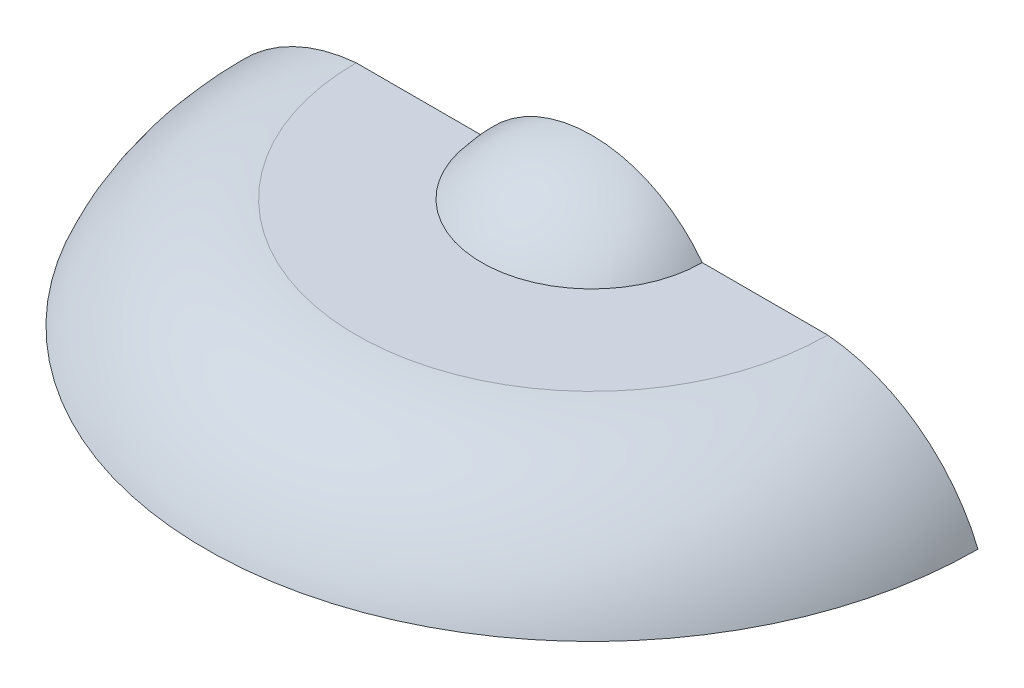
ISO-10303-21;
HEADER;
FILE_DESCRIPTION(('STEP AP214'),'2;1');
FILE_NAME('part.step','',(''),(''),'','','');
FILE_SCHEMA(('AUTOMOTIVE_DESIGN { 1 0 10303 214 1 1 1 1 }'));
ENDSEC;
DATA;
#1=APPLICATION_CONTEXT('core data for automotive mechanical design processes');
#2=APPLICATION_PROTOCOL_DEFINITION('international standard','automotive_design',2000,#1);
#3=PRODUCT_CONTEXT('',#1,'mechanical');
#4=PRODUCT('Part','Part','',(#3));
#5=PRODUCT_RELATED_PRODUCT_CATEGORY('part','',(#4));
#6=PRODUCT_DEFINITION_FORMATION('','',#4);
#7=PRODUCT_DEFINITION_CONTEXT('part definition',#1,'design');
#8=PRODUCT_DEFINITION('design','',#6,#7);
#9=PRODUCT_DEFINITION_SHAPE('','',#8);
#10=(LENGTH_UNIT() NAMED_UNIT(*) SI_UNIT(.MILLI.,.METRE.));
#11=(NAMED_UNIT(*) PLANE_ANGLE_UNIT() SI_UNIT($,.RADIAN.));
#12=(NAMED_UNIT(*) SI_UNIT($,.STERADIAN.) SOLID_ANGLE_UNIT());
#13=UNCERTAINTY_MEASURE_WITH_UNIT(LENGTH_MEASURE(1.E-05),#10,'distance_accuracy_value','');
#14=(GEOMETRIC_REPRESENTATION_CONTEXT(3) GLOBAL_UNCERTAINTY_ASSIGNED_CONTEXT((#13)) GLOBAL_UNIT_ASSIGNED_CONTEXT((#10,
#11,#12)) REPRESENTATION_CONTEXT('',''));
#15=CARTESIAN_POINT('',(0.,0.,0.));
#16=DIRECTION('',(0.,0.,1.));
#17=DIRECTION('',(1.,0.,0.));
#18=AXIS2_PLACEMENT_3D('',#15,#16,#17);
#19=CARTESIAN_POINT('',(0.,6.35,0.));
#20=DIRECTION('',(0.,1.,0.));
#21=DIRECTION('',(-1.,0.,0.));
#22=AXIS2_PLACEMENT_3D('',#19,#20,#21);
#23=SPHERICAL_SURFACE('',#22,31.75);
#24=CARTESIAN_POINT('',(0.,25.4,0.));
#25=DIRECTION('',(0.,1.,0.));
#26=DIRECTION('',(-1.,0.,0.));
#27=AXIS2_PLACEMENT_3D('',#24,#25,#26);
#28=CIRCLE('',#27,25.4);
#29=CARTESIAN_POINT('',(-25.4,25.4,-1.77367252013231E-13));
#30=VERTEX_POINT('',#29);
#31=CARTESIAN_POINT('',(25.4,25.4,0.));
#32=VERTEX_POINT('',#31);
#33=EDGE_CURVE('E11',#30,#32,#28,.T.);
#34=ORIENTED_EDGE('',*,*,#33,.T.);
#35=CARTESIAN_POINT('',(0.,6.35,0.));
#36=DIRECTION('',(0.,0.,-1.));
#37=DIRECTION('',(1.,0.,0.));
#38=AXIS2_PLACEMENT_3D('',#35,#36,#37);
#39=CIRCLE('',#38,31.75);
#40=EDGE_CURVE('E79',#30,#32,#39,.T.);
#41=ORIENTED_EDGE('',*,*,#40,.F.);
#42=EDGE_LOOP('',(#34,#41));
#43=FACE_BOUND('',#42,.T.);
#44=ADVANCED_FACE('F34',(#43),#23,.T.);
#45=CARTESIAN_POINT('',(-54.2790064812948,25.4,-3.79028276440773E-13));
#46=DIRECTION('',(0.,-1.,0.));
#47=DIRECTION('',(1.,0.,0.));
#48=AXIS2_PLACEMENT_3D('',#45,#46,#47);
#49=PLANE('',#48);
#50=CARTESIAN_POINT('',(0.,25.4,0.));
#51=DIRECTION('',(0.,1.,0.));
#52=DIRECTION('',(-1.,0.,0.));
#53=AXIS2_PLACEMENT_3D('',#50,#51,#52);
#54=CIRCLE('',#53,54.2790064812948);
#55=CARTESIAN_POINT('',(-54.2790064812948,25.4,-3.79028276440773E-13));
#56=VERTEX_POINT('',#55);
#57=CARTESIAN_POINT('',(54.2790064812948,25.4,0.));
#58=VERTEX_POINT('',#57);
#59=EDGE_CURVE('E41',#56,#58,#54,.T.);
#60=ORIENTED_EDGE('',*,*,#59,.T.);
#61=DIRECTION('',(-1.,0.,0.));
#62=VECTOR('',#61,1.);
#63=CARTESIAN_POINT('',(54.2790064812948,25.4,0.));
#64=LINE('',#63,#62);
#65=EDGE_CURVE('E74',#58,#32,#64,.T.);
#66=ORIENTED_EDGE('',*,*,#65,.T.);
#67=ORIENTED_EDGE('',*,*,#33,.F.);
#68=DIRECTION('',(1.,0.,0.));
#69=VECTOR('',#68,1.);
#70=CARTESIAN_POINT('',(-54.2790064812948,25.4,-3.79028276440773E-13));
#71=LINE('',#70,#69);
#72=EDGE_CURVE('E86',#56,#30,#71,.T.);
#73=ORIENTED_EDGE('',*,*,#72,.F.);
#74=EDGE_LOOP('',(#60,#66,#67,#73));
#75=FACE_BOUND('',#74,.T.);
#76=ADVANCED_FACE('F88',(#75),#49,.F.);
#77=CARTESIAN_POINT('',(0.,-15.7227332736799,0.));
#78=DIRECTION('',(0.,1.,0.));
#79=DIRECTION('',(-1.,0.,0.));
#80=AXIS2_PLACEMENT_3D('',#77,#78,#79);
#81=TOROIDAL_SURFACE('',#80,50.7369120300162,41.275);
#82=CARTESIAN_POINT('',(0.,0.,0.));
#83=DIRECTION('',(0.,1.,0.));
#84=DIRECTION('',(-1.,0.,0.));
#85=AXIS2_PLACEMENT_3D('',#82,#83,#84);
#86=CIRCLE('',#85,88.9);
#87=CARTESIAN_POINT('',(-88.9,0.,-6.20785382046309E-13));
#88=VERTEX_POINT('',#87);
#89=CARTESIAN_POINT('',(88.9,0.,0.));
#90=VERTEX_POINT('',#89);
#91=EDGE_CURVE('E70',#88,#90,#86,.T.);
#92=ORIENTED_EDGE('',*,*,#91,.T.);
#93=CARTESIAN_POINT('',(50.7369120300162,-15.7227332736799,0.));
#94=DIRECTION('',(0.,0.,1.));
#95=DIRECTION('',(-1.,0.,0.));
#96=AXIS2_PLACEMENT_3D('',#93,#94,#95);
#97=CIRCLE('',#96,41.275);
#98=EDGE_CURVE('E77',#90,#58,#97,.T.);
#99=ORIENTED_EDGE('',*,*,#98,.T.);
#100=ORIENTED_EDGE('',*,*,#59,.F.);
#101=CARTESIAN_POINT('',(-50.7369120300162,-15.7227332736799,-3.54293963086655E-13));
#102=DIRECTION('',(0.,0.,-1.));
#103=DIRECTION('',(1.,0.,0.));
#104=AXIS2_PLACEMENT_3D('',#101,#102,#103);
#105=CIRCLE('',#104,41.275);
#106=EDGE_CURVE('E73',#88,#56,#105,.T.);
#107=ORIENTED_EDGE('',*,*,#106,.F.);
#108=EDGE_LOOP('',(#92,#99,#100,#107));
#109=FACE_BOUND('',#108,.T.);
#110=ADVANCED_FACE('F76',(#109),#81,.T.);
#111=CARTESIAN_POINT('',(0.,0.,0.));
#112=DIRECTION('',(0.,1.,0.));
#113=DIRECTION('',(-1.,0.,0.));
#114=AXIS2_PLACEMENT_3D('',#111,#112,#113);
#115=PLANE('',#114);
#116=DIRECTION('',(-1.,0.,0.));
#117=VECTOR('',#116,1.);
#118=CARTESIAN_POINT('',(0.,0.,0.));
#119=LINE('',#118,#117);
#120=EDGE_CURVE('E67',#90,#88,#119,.T.);
#121=ORIENTED_EDGE('',*,*,#120,.F.);
#122=ORIENTED_EDGE('',*,*,#91,.F.);
#123=EDGE_LOOP('',(#121,#122));
#124=FACE_BOUND('',#123,.T.);
#125=ADVANCED_FACE('F69',(#124),#115,.F.);
#126=CARTESIAN_POINT('',(-50.7369120300162,-15.7227332736799,-3.54293963086655E-13));
#127=DIRECTION('',(0.,0.,1.));
#128=DIRECTION('',(1.,0.,0.));
#129=AXIS2_PLACEMENT_3D('',#126,#127,#128);
#130=PLANE('',#129);
#131=ORIENTED_EDGE('',*,*,#40,.T.);
#132=ORIENTED_EDGE('',*,*,#65,.F.);
#133=ORIENTED_EDGE('',*,*,#98,.F.);
#134=ORIENTED_EDGE('',*,*,#120,.T.);
#135=ORIENTED_EDGE('',*,*,#106,.T.);
#136=ORIENTED_EDGE('',*,*,#72,.T.);
#137=EDGE_LOOP('',(#131,#132,#133,#134,#135,#136));
#138=FACE_BOUND('',#137,.T.);
#139=ADVANCED_FACE('F81',(#138),#130,.F.);
#140=CLOSED_SHELL('',(#44,#76,#110,#125,#139));
#141=MANIFOLD_SOLID_BREP('B2',#140);
#142=ADVANCED_BREP_SHAPE_REPRESENTATION('',(#18,#141),#14);
#143=SHAPE_DEFINITION_REPRESENTATION(#9,#142);
ENDSEC;
END-ISO-10303-21;
